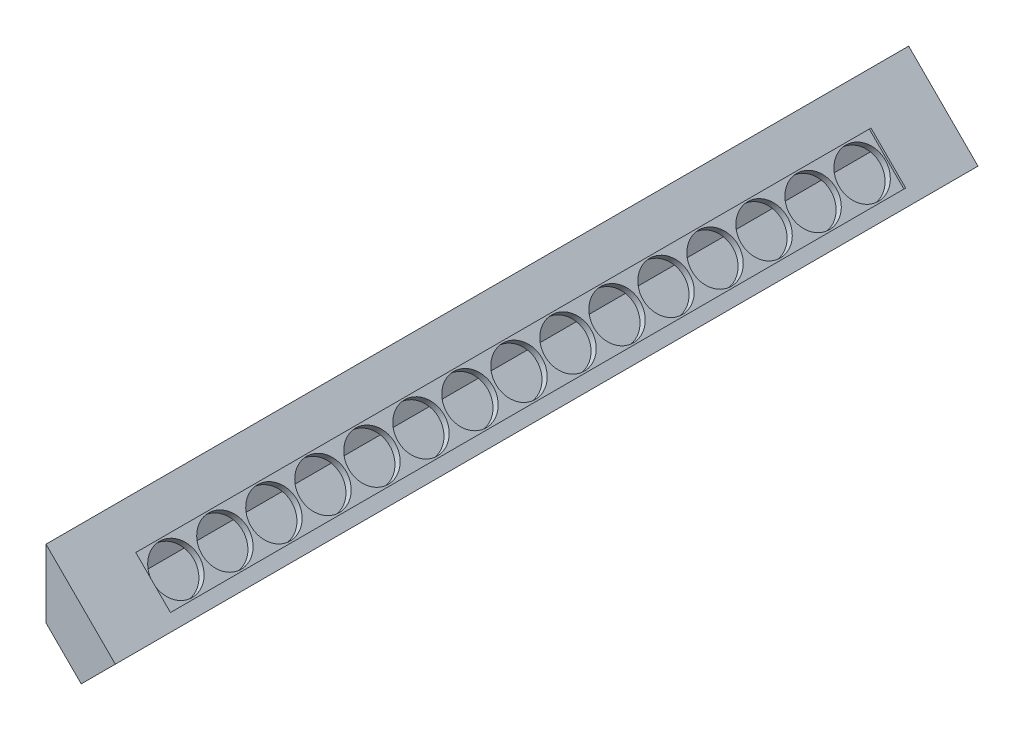
ISO-10303-21;
HEADER;
FILE_DESCRIPTION(('STEP AP214'),'2;1');
FILE_NAME('part.step','',(''),(''),'','','');
FILE_SCHEMA(('AUTOMOTIVE_DESIGN { 1 0 10303 214 1 1 1 1 }'));
ENDSEC;
DATA;
#1=APPLICATION_CONTEXT('core data for automotive mechanical design processes');
#2=APPLICATION_PROTOCOL_DEFINITION('international standard','automotive_design',2000,#1);
#3=PRODUCT_CONTEXT('',#1,'mechanical');
#4=PRODUCT('Part','Part','',(#3));
#5=PRODUCT_RELATED_PRODUCT_CATEGORY('part','',(#4));
#6=PRODUCT_DEFINITION_FORMATION('','',#4);
#7=PRODUCT_DEFINITION_CONTEXT('part definition',#1,'design');
#8=PRODUCT_DEFINITION('design','',#6,#7);
#9=PRODUCT_DEFINITION_SHAPE('','',#8);
#10=(LENGTH_UNIT() NAMED_UNIT(*) SI_UNIT(.MILLI.,.METRE.));
#11=(NAMED_UNIT(*) PLANE_ANGLE_UNIT() SI_UNIT($,.RADIAN.));
#12=(NAMED_UNIT(*) SI_UNIT($,.STERADIAN.) SOLID_ANGLE_UNIT());
#13=UNCERTAINTY_MEASURE_WITH_UNIT(LENGTH_MEASURE(1.E-05),#10,'distance_accuracy_value','');
#14=(GEOMETRIC_REPRESENTATION_CONTEXT(3) GLOBAL_UNCERTAINTY_ASSIGNED_CONTEXT((#13)) GLOBAL_UNIT_ASSIGNED_CONTEXT((#10,
#11,#12)) REPRESENTATION_CONTEXT('',''));
#15=CARTESIAN_POINT('',(0.,0.,0.));
#16=DIRECTION('',(0.,0.,1.));
#17=DIRECTION('',(1.,0.,0.));
#18=AXIS2_PLACEMENT_3D('',#15,#16,#17);
#19=CARTESIAN_POINT('',(-36.6281312654624,16.2634559672912,440.));
#20=DIRECTION('',(0.707106781186565,0.70710678118653,0.));
#21=DIRECTION('',(-0.70710678118653,0.707106781186565,0.));
#22=AXIS2_PLACEMENT_3D('',#19,#20,#21);
#23=CYLINDRICAL_SURFACE('',#22,23.5000000000004);
#24=CARTESIAN_POINT('',(-28.2135605693423,24.6780266634109,440.));
#25=DIRECTION('',(0.707106781186565,0.70710678118653,0.));
#26=DIRECTION('',(-0.70710678118653,0.707106781186565,0.));
#27=AXIS2_PLACEMENT_3D('',#24,#25,#26);
#28=CIRCLE('',#27,23.5000000000004);
#29=CARTESIAN_POINT('',(-44.830569927226,41.2950360212954,440.));
#30=VERTEX_POINT('',#29);
#31=EDGE_CURVE('E281',#30,#30,#28,.T.);
#32=ORIENTED_EDGE('',*,*,#31,.T.);
#33=EDGE_LOOP('',(#32));
#34=FACE_BOUND('',#33,.T.);
#35=CARTESIAN_POINT('',(-33.5168614282421,19.3747258045113,440.));
#36=DIRECTION('',(-0.707106781186549,-0.707106781186546,0.));
#37=DIRECTION('',(0.707106781186546,-0.707106781186549,0.));
#38=AXIS2_PLACEMENT_3D('',#35,#36,#37);
#39=CIRCLE('',#38,23.5000000000004);
#40=CARTESIAN_POINT('',(-16.899852070358,2.75771644662712,440.));
#41=VERTEX_POINT('',#40);
#42=EDGE_CURVE('E155',#41,#41,#39,.F.);
#43=ORIENTED_EDGE('',*,*,#42,.F.);
#44=EDGE_LOOP('',(#43));
#45=FACE_BOUND('',#44,.T.);
#46=ADVANCED_FACE('F33',(#34,#45),#23,.F.);
#47=CARTESIAN_POINT('',(-36.6281312654612,16.2634559672899,690.));
#48=DIRECTION('',(0.707106781186565,0.70710678118653,0.));
#49=DIRECTION('',(-0.70710678118653,0.707106781186565,0.));
#50=AXIS2_PLACEMENT_3D('',#47,#48,#49);
#51=CYLINDRICAL_SURFACE('',#50,23.5000000000003);
#52=CARTESIAN_POINT('',(-28.2135605693411,24.6780266634096,690.));
#53=DIRECTION('',(0.707106781186565,0.70710678118653,0.));
#54=DIRECTION('',(-0.70710678118653,0.707106781186565,0.));
#55=AXIS2_PLACEMENT_3D('',#52,#53,#54);
#56=CIRCLE('',#55,23.5000000000003);
#57=CARTESIAN_POINT('',(-44.8305699272247,41.2950360212941,690.));
#58=VERTEX_POINT('',#57);
#59=EDGE_CURVE('E272',#58,#58,#56,.T.);
#60=ORIENTED_EDGE('',*,*,#59,.T.);
#61=EDGE_LOOP('',(#60));
#62=FACE_BOUND('',#61,.T.);
#63=CARTESIAN_POINT('',(-33.5168614282409,19.3747258045101,690.));
#64=DIRECTION('',(-0.707106781186549,-0.707106781186546,0.));
#65=DIRECTION('',(0.707106781186546,-0.707106781186549,0.));
#66=AXIS2_PLACEMENT_3D('',#63,#64,#65);
#67=CIRCLE('',#66,23.5000000000003);
#68=CARTESIAN_POINT('',(-16.8998520703569,2.75771644662597,690.));
#69=VERTEX_POINT('',#68);
#70=EDGE_CURVE('E244',#69,#69,#67,.F.);
#71=ORIENTED_EDGE('',*,*,#70,.F.);
#72=EDGE_LOOP('',(#71));
#73=FACE_BOUND('',#72,.T.);
#74=ADVANCED_FACE('F393',(#62,#73),#51,.F.);
#75=CARTESIAN_POINT('',(-36.6281312654609,16.2634559672897,740.));
#76=DIRECTION('',(0.707106781186565,0.70710678118653,0.));
#77=DIRECTION('',(-0.70710678118653,0.707106781186565,0.));
#78=AXIS2_PLACEMENT_3D('',#75,#76,#77);
#79=CYLINDRICAL_SURFACE('',#78,23.5000000000002);
#80=CARTESIAN_POINT('',(-28.2135605693408,24.6780266634094,740.));
#81=DIRECTION('',(0.707106781186565,0.70710678118653,0.));
#82=DIRECTION('',(-0.70710678118653,0.707106781186565,0.));
#83=AXIS2_PLACEMENT_3D('',#80,#81,#82);
#84=CIRCLE('',#83,23.5000000000002);
#85=CARTESIAN_POINT('',(-44.8305699272244,41.2950360212938,740.));
#86=VERTEX_POINT('',#85);
#87=EDGE_CURVE('E267',#86,#86,#84,.T.);
#88=ORIENTED_EDGE('',*,*,#87,.T.);
#89=EDGE_LOOP('',(#88));
#90=FACE_BOUND('',#89,.T.);
#91=CARTESIAN_POINT('',(-33.5168614282406,19.3747258045098,740.));
#92=DIRECTION('',(-0.707106781186549,-0.707106781186546,0.));
#93=DIRECTION('',(0.707106781186546,-0.707106781186549,0.));
#94=AXIS2_PLACEMENT_3D('',#91,#92,#93);
#95=CIRCLE('',#94,23.5000000000002);
#96=CARTESIAN_POINT('',(-16.8998520703567,2.75771644662581,740.));
#97=VERTEX_POINT('',#96);
#98=EDGE_CURVE('E250',#97,#97,#95,.F.);
#99=ORIENTED_EDGE('',*,*,#98,.F.);
#100=EDGE_LOOP('',(#99));
#101=FACE_BOUND('',#100,.T.);
#102=ADVANCED_FACE('F399',(#90,#101),#79,.F.);
#103=CARTESIAN_POINT('',(-36.6281312654607,16.2634559672895,790.));
#104=DIRECTION('',(0.707106781186565,0.70710678118653,0.));
#105=DIRECTION('',(-0.70710678118653,0.707106781186565,0.));
#106=AXIS2_PLACEMENT_3D('',#103,#104,#105);
#107=CYLINDRICAL_SURFACE('',#106,23.5000000000003);
#108=CARTESIAN_POINT('',(-28.2135605693406,24.6780266634092,790.));
#109=DIRECTION('',(0.707106781186565,0.70710678118653,0.));
#110=DIRECTION('',(-0.70710678118653,0.707106781186565,0.));
#111=AXIS2_PLACEMENT_3D('',#108,#109,#110);
#112=CIRCLE('',#111,23.5000000000003);
#113=CARTESIAN_POINT('',(-44.8305699272242,41.2950360212936,790.));
#114=VERTEX_POINT('',#113);
#115=EDGE_CURVE('E264',#114,#114,#112,.T.);
#116=ORIENTED_EDGE('',*,*,#115,.T.);
#117=EDGE_LOOP('',(#116));
#118=FACE_BOUND('',#117,.T.);
#119=CARTESIAN_POINT('',(-33.5168614282404,19.3747258045096,790.));
#120=DIRECTION('',(-0.707106781186549,-0.707106781186546,0.));
#121=DIRECTION('',(0.707106781186546,-0.707106781186549,0.));
#122=AXIS2_PLACEMENT_3D('',#119,#120,#121);
#123=CIRCLE('',#122,23.5000000000003);
#124=CARTESIAN_POINT('',(-16.8998520703564,2.75771644662549,790.));
#125=VERTEX_POINT('',#124);
#126=EDGE_CURVE('E247',#125,#125,#123,.F.);
#127=ORIENTED_EDGE('',*,*,#126,.F.);
#128=EDGE_LOOP('',(#127));
#129=FACE_BOUND('',#128,.T.);
#130=ADVANCED_FACE('F578',(#118,#129),#107,.F.);
#131=CARTESIAN_POINT('',(-36.6281312654624,16.2634559672912,390.));
#132=DIRECTION('',(0.707106781186565,0.70710678118653,0.));
#133=DIRECTION('',(-0.70710678118653,0.707106781186565,0.));
#134=AXIS2_PLACEMENT_3D('',#131,#132,#133);
#135=CYLINDRICAL_SURFACE('',#134,23.5000000000004);
#136=CARTESIAN_POINT('',(-28.2135605693423,24.6780266634109,390.));
#137=DIRECTION('',(0.707106781186565,0.70710678118653,0.));
#138=DIRECTION('',(-0.70710678118653,0.707106781186565,0.));
#139=AXIS2_PLACEMENT_3D('',#136,#137,#138);
#140=CIRCLE('',#139,23.5000000000004);
#141=CARTESIAN_POINT('',(-44.830569927226,41.2950360212954,390.));
#142=VERTEX_POINT('',#141);
#143=EDGE_CURVE('E268',#142,#142,#140,.T.);
#144=ORIENTED_EDGE('',*,*,#143,.T.);
#145=EDGE_LOOP('',(#144));
#146=FACE_BOUND('',#145,.T.);
#147=CARTESIAN_POINT('',(-33.5168614282421,19.3747258045113,390.));
#148=DIRECTION('',(-0.707106781186549,-0.707106781186546,0.));
#149=DIRECTION('',(0.707106781186546,-0.707106781186549,0.));
#150=AXIS2_PLACEMENT_3D('',#147,#148,#149);
#151=CIRCLE('',#150,23.5000000000004);
#152=CARTESIAN_POINT('',(-16.899852070358,2.75771644662712,390.));
#153=VERTEX_POINT('',#152);
#154=EDGE_CURVE('E231',#153,#153,#151,.F.);
#155=ORIENTED_EDGE('',*,*,#154,.F.);
#156=EDGE_LOOP('',(#155));
#157=FACE_BOUND('',#156,.T.);
#158=ADVANCED_FACE('F587',(#146,#157),#135,.F.);
#159=CARTESIAN_POINT('',(-36.6281312654614,16.2634559672902,640.));
#160=DIRECTION('',(0.707106781186565,0.70710678118653,0.));
#161=DIRECTION('',(-0.70710678118653,0.707106781186565,0.));
#162=AXIS2_PLACEMENT_3D('',#159,#160,#161);
#163=CYLINDRICAL_SURFACE('',#162,23.5000000000002);
#164=CARTESIAN_POINT('',(-28.2135605693413,24.6780266634099,640.));
#165=DIRECTION('',(0.707106781186565,0.70710678118653,0.));
#166=DIRECTION('',(-0.70710678118653,0.707106781186565,0.));
#167=AXIS2_PLACEMENT_3D('',#164,#165,#166);
#168=CIRCLE('',#167,23.5000000000002);
#169=CARTESIAN_POINT('',(-44.8305699272249,41.2950360212943,640.));
#170=VERTEX_POINT('',#169);
#171=EDGE_CURVE('E275',#170,#170,#168,.T.);
#172=ORIENTED_EDGE('',*,*,#171,.T.);
#173=EDGE_LOOP('',(#172));
#174=FACE_BOUND('',#173,.T.);
#175=CARTESIAN_POINT('',(-33.5168614282411,19.3747258045103,640.));
#176=DIRECTION('',(-0.707106781186549,-0.707106781186546,0.));
#177=DIRECTION('',(0.707106781186546,-0.707106781186549,0.));
#178=AXIS2_PLACEMENT_3D('',#175,#176,#177);
#179=CIRCLE('',#178,23.5000000000002);
#180=CARTESIAN_POINT('',(-16.8998520703572,2.75771644662631,640.));
#181=VERTEX_POINT('',#180);
#182=EDGE_CURVE('E241',#181,#181,#179,.F.);
#183=ORIENTED_EDGE('',*,*,#182,.F.);
#184=EDGE_LOOP('',(#183));
#185=FACE_BOUND('',#184,.T.);
#186=ADVANCED_FACE('F596',(#174,#185),#163,.F.);
#187=CARTESIAN_POINT('',(-36.6281312654617,16.2634559672904,590.));
#188=DIRECTION('',(0.707106781186565,0.70710678118653,0.));
#189=DIRECTION('',(-0.70710678118653,0.707106781186565,0.));
#190=AXIS2_PLACEMENT_3D('',#187,#188,#189);
#191=CYLINDRICAL_SURFACE('',#190,23.5000000000003);
#192=CARTESIAN_POINT('',(-28.2135605693416,24.6780266634101,590.));
#193=DIRECTION('',(0.707106781186565,0.70710678118653,0.));
#194=DIRECTION('',(-0.70710678118653,0.707106781186565,0.));
#195=AXIS2_PLACEMENT_3D('',#192,#193,#194);
#196=CIRCLE('',#195,23.5000000000003);
#197=CARTESIAN_POINT('',(-44.8305699272252,41.2950360212946,590.));
#198=VERTEX_POINT('',#197);
#199=EDGE_CURVE('E285',#198,#198,#196,.T.);
#200=ORIENTED_EDGE('',*,*,#199,.T.);
#201=EDGE_LOOP('',(#200));
#202=FACE_BOUND('',#201,.T.);
#203=CARTESIAN_POINT('',(-33.5168614282414,19.3747258045106,590.));
#204=DIRECTION('',(-0.707106781186549,-0.707106781186546,0.));
#205=DIRECTION('',(0.707106781186546,-0.707106781186549,0.));
#206=AXIS2_PLACEMENT_3D('',#203,#204,#205);
#207=CIRCLE('',#206,23.5000000000003);
#208=CARTESIAN_POINT('',(-16.8998520703574,2.75771644662648,590.));
#209=VERTEX_POINT('',#208);
#210=EDGE_CURVE('E238',#209,#209,#207,.F.);
#211=ORIENTED_EDGE('',*,*,#210,.F.);
#212=EDGE_LOOP('',(#211));
#213=FACE_BOUND('',#212,.T.);
#214=ADVANCED_FACE('F605',(#202,#213),#191,.F.);
#215=CARTESIAN_POINT('',(-36.6281312654619,16.2634559672907,540.));
#216=DIRECTION('',(0.707106781186565,0.70710678118653,0.));
#217=DIRECTION('',(-0.70710678118653,0.707106781186565,0.));
#218=AXIS2_PLACEMENT_3D('',#215,#216,#217);
#219=CYLINDRICAL_SURFACE('',#218,23.5000000000003);
#220=CARTESIAN_POINT('',(-28.2135605693418,24.6780266634104,540.));
#221=DIRECTION('',(0.707106781186565,0.70710678118653,0.));
#222=DIRECTION('',(-0.70710678118653,0.707106781186565,0.));
#223=AXIS2_PLACEMENT_3D('',#220,#221,#222);
#224=CIRCLE('',#223,23.5000000000003);
#225=CARTESIAN_POINT('',(-44.8305699272254,41.2950360212949,540.));
#226=VERTEX_POINT('',#225);
#227=EDGE_CURVE('E282',#226,#226,#224,.T.);
#228=ORIENTED_EDGE('',*,*,#227,.T.);
#229=EDGE_LOOP('',(#228));
#230=FACE_BOUND('',#229,.T.);
#231=CARTESIAN_POINT('',(-33.5168614282416,19.3747258045108,540.));
#232=DIRECTION('',(-0.707106781186549,-0.707106781186546,0.));
#233=DIRECTION('',(0.707106781186546,-0.707106781186549,0.));
#234=AXIS2_PLACEMENT_3D('',#231,#232,#233);
#235=CIRCLE('',#234,23.5000000000003);
#236=CARTESIAN_POINT('',(-16.8998520703576,2.75771644662672,540.));
#237=VERTEX_POINT('',#236);
#238=EDGE_CURVE('E235',#237,#237,#235,.F.);
#239=ORIENTED_EDGE('',*,*,#238,.F.);
#240=EDGE_LOOP('',(#239));
#241=FACE_BOUND('',#240,.T.);
#242=ADVANCED_FACE('F614',(#230,#241),#219,.F.);
#243=CARTESIAN_POINT('',(-36.6281312654622,16.2634559672909,490.));
#244=DIRECTION('',(0.707106781186565,0.70710678118653,0.));
#245=DIRECTION('',(-0.70710678118653,0.707106781186565,0.));
#246=AXIS2_PLACEMENT_3D('',#243,#244,#245);
#247=CYLINDRICAL_SURFACE('',#246,23.5000000000004);
#248=CARTESIAN_POINT('',(-28.2135605693421,24.6780266634106,490.));
#249=DIRECTION('',(0.707106781186565,0.70710678118653,0.));
#250=DIRECTION('',(-0.70710678118653,0.707106781186565,0.));
#251=AXIS2_PLACEMENT_3D('',#248,#249,#250);
#252=CIRCLE('',#251,23.5000000000004);
#253=CARTESIAN_POINT('',(-44.8305699272258,41.2950360212952,490.));
#254=VERTEX_POINT('',#253);
#255=EDGE_CURVE('E278',#254,#254,#252,.T.);
#256=ORIENTED_EDGE('',*,*,#255,.T.);
#257=EDGE_LOOP('',(#256));
#258=FACE_BOUND('',#257,.T.);
#259=CARTESIAN_POINT('',(-33.5168614282419,19.3747258045111,490.));
#260=DIRECTION('',(-0.707106781186549,-0.707106781186546,0.));
#261=DIRECTION('',(0.707106781186546,-0.707106781186549,0.));
#262=AXIS2_PLACEMENT_3D('',#259,#260,#261);
#263=CIRCLE('',#262,23.5000000000004);
#264=CARTESIAN_POINT('',(-16.8998520703577,2.75771644662684,490.));
#265=VERTEX_POINT('',#264);
#266=EDGE_CURVE('E232',#265,#265,#263,.F.);
#267=ORIENTED_EDGE('',*,*,#266,.F.);
#268=EDGE_LOOP('',(#267));
#269=FACE_BOUND('',#268,.T.);
#270=ADVANCED_FACE('F623',(#258,#269),#247,.F.);
#271=CARTESIAN_POINT('',(-36.6281312654624,16.2634559672912,340.));
#272=DIRECTION('',(0.707106781186565,0.70710678118653,0.));
#273=DIRECTION('',(-0.70710678118653,0.707106781186565,0.));
#274=AXIS2_PLACEMENT_3D('',#271,#272,#273);
#275=CYLINDRICAL_SURFACE('',#274,23.5000000000004);
#276=CARTESIAN_POINT('',(-28.2135605693423,24.6780266634109,340.));
#277=DIRECTION('',(0.707106781186565,0.70710678118653,0.));
#278=DIRECTION('',(-0.70710678118653,0.707106781186565,0.));
#279=AXIS2_PLACEMENT_3D('',#276,#277,#278);
#280=CIRCLE('',#279,23.5000000000004);
#281=CARTESIAN_POINT('',(-44.830569927226,41.2950360212954,340.));
#282=VERTEX_POINT('',#281);
#283=EDGE_CURVE('E271',#282,#282,#280,.T.);
#284=ORIENTED_EDGE('',*,*,#283,.T.);
#285=EDGE_LOOP('',(#284));
#286=FACE_BOUND('',#285,.T.);
#287=CARTESIAN_POINT('',(-33.5168614282421,19.3747258045113,340.));
#288=DIRECTION('',(-0.707106781186549,-0.707106781186546,0.));
#289=DIRECTION('',(0.707106781186546,-0.707106781186549,0.));
#290=AXIS2_PLACEMENT_3D('',#287,#288,#289);
#291=CIRCLE('',#290,23.5000000000004);
#292=CARTESIAN_POINT('',(-16.899852070358,2.75771644662712,340.));
#293=VERTEX_POINT('',#292);
#294=EDGE_CURVE('E228',#293,#293,#291,.F.);
#295=ORIENTED_EDGE('',*,*,#294,.F.);
#296=EDGE_LOOP('',(#295));
#297=FACE_BOUND('',#296,.T.);
#298=ADVANCED_FACE('F632',(#286,#297),#275,.F.);
#299=CARTESIAN_POINT('',(-36.6281312654624,16.2634559672912,290.));
#300=DIRECTION('',(0.707106781186565,0.70710678118653,0.));
#301=DIRECTION('',(-0.70710678118653,0.707106781186565,0.));
#302=AXIS2_PLACEMENT_3D('',#299,#300,#301);
#303=CYLINDRICAL_SURFACE('',#302,23.5000000000004);
#304=CARTESIAN_POINT('',(-28.2135605693423,24.6780266634109,290.));
#305=DIRECTION('',(0.707106781186565,0.70710678118653,0.));
#306=DIRECTION('',(-0.70710678118653,0.707106781186565,0.));
#307=AXIS2_PLACEMENT_3D('',#304,#305,#306);
#308=CIRCLE('',#307,23.5000000000004);
#309=CARTESIAN_POINT('',(-44.830569927226,41.2950360212954,290.));
#310=VERTEX_POINT('',#309);
#311=EDGE_CURVE('E292',#310,#310,#308,.T.);
#312=ORIENTED_EDGE('',*,*,#311,.T.);
#313=EDGE_LOOP('',(#312));
#314=FACE_BOUND('',#313,.T.);
#315=CARTESIAN_POINT('',(-33.5168614282421,19.3747258045113,290.));
#316=DIRECTION('',(-0.707106781186549,-0.707106781186546,0.));
#317=DIRECTION('',(0.707106781186546,-0.707106781186549,0.));
#318=AXIS2_PLACEMENT_3D('',#315,#316,#317);
#319=CIRCLE('',#318,23.5000000000004);
#320=CARTESIAN_POINT('',(-16.899852070358,2.75771644662712,290.));
#321=VERTEX_POINT('',#320);
#322=EDGE_CURVE('E225',#321,#321,#319,.F.);
#323=ORIENTED_EDGE('',*,*,#322,.F.);
#324=EDGE_LOOP('',(#323));
#325=FACE_BOUND('',#324,.T.);
#326=ADVANCED_FACE('F641',(#314,#325),#303,.F.);
#327=CARTESIAN_POINT('',(-36.6281312654624,16.2634559672912,240.));
#328=DIRECTION('',(0.707106781186565,0.70710678118653,0.));
#329=DIRECTION('',(-0.70710678118653,0.707106781186565,0.));
#330=AXIS2_PLACEMENT_3D('',#327,#328,#329);
#331=CYLINDRICAL_SURFACE('',#330,23.5000000000004);
#332=CARTESIAN_POINT('',(-28.2135605693423,24.6780266634109,240.));
#333=DIRECTION('',(0.707106781186565,0.70710678118653,0.));
#334=DIRECTION('',(-0.70710678118653,0.707106781186565,0.));
#335=AXIS2_PLACEMENT_3D('',#332,#333,#334);
#336=CIRCLE('',#335,23.5000000000004);
#337=CARTESIAN_POINT('',(-44.8305699272261,41.2950360212955,240.));
#338=VERTEX_POINT('',#337);
#339=EDGE_CURVE('E295',#338,#338,#336,.T.);
#340=ORIENTED_EDGE('',*,*,#339,.T.);
#341=EDGE_LOOP('',(#340));
#342=FACE_BOUND('',#341,.T.);
#343=CARTESIAN_POINT('',(-33.5168614282421,19.3747258045113,240.));
#344=DIRECTION('',(-0.707106781186549,-0.707106781186546,0.));
#345=DIRECTION('',(0.707106781186546,-0.707106781186549,0.));
#346=AXIS2_PLACEMENT_3D('',#343,#344,#345);
#347=CIRCLE('',#346,23.5000000000004);
#348=CARTESIAN_POINT('',(-16.899852070358,2.75771644662709,240.));
#349=VERTEX_POINT('',#348);
#350=EDGE_CURVE('E222',#349,#349,#347,.F.);
#351=ORIENTED_EDGE('',*,*,#350,.F.);
#352=EDGE_LOOP('',(#351));
#353=FACE_BOUND('',#352,.T.);
#354=ADVANCED_FACE('F650',(#342,#353),#331,.F.);
#355=CARTESIAN_POINT('',(-36.6281312654624,16.2634559672912,190.));
#356=DIRECTION('',(0.707106781186565,0.70710678118653,0.));
#357=DIRECTION('',(-0.70710678118653,0.707106781186565,0.));
#358=AXIS2_PLACEMENT_3D('',#355,#356,#357);
#359=CYLINDRICAL_SURFACE('',#358,23.5000000000004);
#360=CARTESIAN_POINT('',(-28.2135605693423,24.6780266634109,190.));
#361=DIRECTION('',(0.707106781186565,0.70710678118653,0.));
#362=DIRECTION('',(-0.70710678118653,0.707106781186565,0.));
#363=AXIS2_PLACEMENT_3D('',#360,#361,#362);
#364=CIRCLE('',#363,23.5000000000004);
#365=CARTESIAN_POINT('',(-44.8305699272261,41.2950360212955,190.));
#366=VERTEX_POINT('',#365);
#367=EDGE_CURVE('E298',#366,#366,#364,.T.);
#368=ORIENTED_EDGE('',*,*,#367,.T.);
#369=EDGE_LOOP('',(#368));
#370=FACE_BOUND('',#369,.T.);
#371=CARTESIAN_POINT('',(-33.5168614282421,19.3747258045113,190.));
#372=DIRECTION('',(-0.707106781186549,-0.707106781186546,0.));
#373=DIRECTION('',(0.707106781186546,-0.707106781186549,0.));
#374=AXIS2_PLACEMENT_3D('',#371,#372,#373);
#375=CIRCLE('',#374,23.5000000000004);
#376=CARTESIAN_POINT('',(-16.899852070358,2.75771644662709,190.));
#377=VERTEX_POINT('',#376);
#378=EDGE_CURVE('E219',#377,#377,#375,.F.);
#379=ORIENTED_EDGE('',*,*,#378,.F.);
#380=EDGE_LOOP('',(#379));
#381=FACE_BOUND('',#380,.T.);
#382=ADVANCED_FACE('F659',(#370,#381),#359,.F.);
#383=CARTESIAN_POINT('',(-36.6281312654624,16.2634559672912,140.));
#384=DIRECTION('',(0.707106781186565,0.70710678118653,0.));
#385=DIRECTION('',(-0.70710678118653,0.707106781186565,0.));
#386=AXIS2_PLACEMENT_3D('',#383,#384,#385);
#387=CYLINDRICAL_SURFACE('',#386,23.5000000000004);
#388=CARTESIAN_POINT('',(-28.2135605693423,24.6780266634109,140.));
#389=DIRECTION('',(0.707106781186565,0.70710678118653,0.));
#390=DIRECTION('',(-0.70710678118653,0.707106781186565,0.));
#391=AXIS2_PLACEMENT_3D('',#388,#389,#390);
#392=CIRCLE('',#391,23.5000000000004);
#393=CARTESIAN_POINT('',(-44.8305699272261,41.2950360212955,140.));
#394=VERTEX_POINT('',#393);
#395=EDGE_CURVE('E301',#394,#394,#392,.T.);
#396=ORIENTED_EDGE('',*,*,#395,.T.);
#397=EDGE_LOOP('',(#396));
#398=FACE_BOUND('',#397,.T.);
#399=CARTESIAN_POINT('',(-33.5168614282421,19.3747258045113,140.));
#400=DIRECTION('',(-0.707106781186549,-0.707106781186546,0.));
#401=DIRECTION('',(0.707106781186546,-0.707106781186549,0.));
#402=AXIS2_PLACEMENT_3D('',#399,#400,#401);
#403=CIRCLE('',#402,23.5000000000004);
#404=CARTESIAN_POINT('',(-16.899852070358,2.75771644662709,140.));
#405=VERTEX_POINT('',#404);
#406=EDGE_CURVE('E216',#405,#405,#403,.F.);
#407=ORIENTED_EDGE('',*,*,#406,.F.);
#408=EDGE_LOOP('',(#407));
#409=FACE_BOUND('',#408,.T.);
#410=ADVANCED_FACE('F388',(#398,#409),#387,.F.);
#411=CARTESIAN_POINT('',(-36.6281312654624,16.2634559672912,90.));
#412=DIRECTION('',(0.707106781186565,0.70710678118653,0.));
#413=DIRECTION('',(-0.70710678118653,0.707106781186565,0.));
#414=AXIS2_PLACEMENT_3D('',#411,#412,#413);
#415=CYLINDRICAL_SURFACE('',#414,23.5000000000004);
#416=CARTESIAN_POINT('',(-28.2135605693423,24.6780266634109,90.));
#417=DIRECTION('',(0.707106781186565,0.70710678118653,0.));
#418=DIRECTION('',(-0.70710678118653,0.707106781186565,0.));
#419=AXIS2_PLACEMENT_3D('',#416,#417,#418);
#420=CIRCLE('',#419,23.5000000000004);
#421=CARTESIAN_POINT('',(-44.8305699272261,41.2950360212955,90.));
#422=VERTEX_POINT('',#421);
#423=EDGE_CURVE('E263',#422,#422,#420,.T.);
#424=ORIENTED_EDGE('',*,*,#423,.T.);
#425=EDGE_LOOP('',(#424));
#426=FACE_BOUND('',#425,.T.);
#427=CARTESIAN_POINT('',(-33.5168614282421,19.3747258045113,90.));
#428=DIRECTION('',(-0.707106781186549,-0.707106781186546,0.));
#429=DIRECTION('',(0.707106781186546,-0.707106781186549,0.));
#430=AXIS2_PLACEMENT_3D('',#427,#428,#429);
#431=CIRCLE('',#430,23.5000000000004);
#432=CARTESIAN_POINT('',(-16.899852070358,2.75771644662709,90.));
#433=VERTEX_POINT('',#432);
#434=EDGE_CURVE('E213',#433,#433,#431,.F.);
#435=ORIENTED_EDGE('',*,*,#434,.F.);
#436=EDGE_LOOP('',(#435));
#437=FACE_BOUND('',#436,.T.);
#438=ADVANCED_FACE('F381',(#426,#437),#415,.F.);
#439=CARTESIAN_POINT('',(0.,0.,880.));
#440=DIRECTION('',(-0.707106781186547,-0.707106781186547,0.));
#441=DIRECTION('',(0.707106781186548,-0.707106781186548,0.));
#442=AXIS2_PLACEMENT_3D('',#439,#440,#441);
#443=PLANE('',#442);
#444=DIRECTION('',(0.,0.,1.));
#445=VECTOR('',#444,1.);
#446=CARTESIAN_POINT('',(-44.1234631460402,44.1234631460404,815.));
#447=LINE('',#446,#445);
#448=CARTESIAN_POINT('',(-44.1234631460407,44.1234631460407,65.0000000000001));
#449=VERTEX_POINT('',#448);
#450=CARTESIAN_POINT('',(-44.1234631460402,44.1234631460404,815.));
#451=VERTEX_POINT('',#450);
#452=EDGE_CURVE('E323',#449,#451,#447,.T.);
#453=ORIENTED_EDGE('',*,*,#452,.F.);
#454=DIRECTION('',(-0.707106781186546,0.707106781186549,0.));
#455=VECTOR('',#454,1.);
#456=CARTESIAN_POINT('',(-8.7681240867131,8.76812408671314,64.9999999999999));
#457=LINE('',#456,#455);
#458=CARTESIAN_POINT('',(-8.7681240867131,8.76812408671314,64.9999999999999));
#459=VERTEX_POINT('',#458);
#460=EDGE_CURVE('E48',#459,#449,#457,.T.);
#461=ORIENTED_EDGE('',*,*,#460,.F.);
#462=DIRECTION('',(0.,0.,-1.));
#463=VECTOR('',#462,1.);
#464=CARTESIAN_POINT('',(-8.76812408671275,8.76812408671279,815.));
#465=LINE('',#464,#463);
#466=CARTESIAN_POINT('',(-8.76812408671275,8.76812408671279,815.));
#467=VERTEX_POINT('',#466);
#468=EDGE_CURVE('E312',#467,#459,#465,.T.);
#469=ORIENTED_EDGE('',*,*,#468,.F.);
#470=DIRECTION('',(0.707106781186546,-0.707106781186549,0.));
#471=VECTOR('',#470,1.);
#472=CARTESIAN_POINT('',(-8.76812408671275,8.76812408671279,815.));
#473=LINE('',#472,#471);
#474=EDGE_CURVE('E326',#451,#467,#473,.T.);
#475=ORIENTED_EDGE('',*,*,#474,.F.);
#476=EDGE_LOOP('',(#453,#461,#469,#475));
#477=FACE_BOUND('',#476,.T.);
#478=DIRECTION('',(-0.707106781186547,0.707106781186547,0.));
#479=VECTOR('',#478,1.);
#480=CARTESIAN_POINT('',(0.,0.,0.));
#481=LINE('',#480,#479);
#482=CARTESIAN_POINT('',(0.,0.,0.));
#483=VERTEX_POINT('',#482);
#484=CARTESIAN_POINT('',(-70.7106781186548,70.7106781186548,0.));
#485=VERTEX_POINT('',#484);
#486=EDGE_CURVE('E333',#483,#485,#481,.T.);
#487=ORIENTED_EDGE('',*,*,#486,.T.);
#488=DIRECTION('',(0.,0.,-1.));
#489=VECTOR('',#488,1.);
#490=CARTESIAN_POINT('',(-70.7106781186548,70.7106781186548,880.));
#491=LINE('',#490,#489);
#492=CARTESIAN_POINT('',(-70.7106781186548,70.7106781186548,880.));
#493=VERTEX_POINT('',#492);
#494=EDGE_CURVE('E355',#493,#485,#491,.T.);
#495=ORIENTED_EDGE('',*,*,#494,.F.);
#496=DIRECTION('',(-0.707106781186547,0.707106781186547,0.));
#497=VECTOR('',#496,1.);
#498=CARTESIAN_POINT('',(0.,0.,880.));
#499=LINE('',#498,#497);
#500=CARTESIAN_POINT('',(0.,0.,880.));
#501=VERTEX_POINT('',#500);
#502=EDGE_CURVE('E339',#501,#493,#499,.T.);
#503=ORIENTED_EDGE('',*,*,#502,.F.);
#504=DIRECTION('',(0.,0.,-1.));
#505=VECTOR('',#504,1.);
#506=CARTESIAN_POINT('',(0.,0.,880.));
#507=LINE('',#506,#505);
#508=EDGE_CURVE('E347',#501,#483,#507,.T.);
#509=ORIENTED_EDGE('',*,*,#508,.T.);
#510=EDGE_LOOP('',(#487,#495,#503,#509));
#511=FACE_BOUND('',#510,.T.);
#512=ADVANCED_FACE('F379',(#477,#511),#443,.F.);
#513=CARTESIAN_POINT('',(-70.7106781186548,70.7106781186548,880.));
#514=DIRECTION('',(1.,0.,0.));
#515=DIRECTION('',(0.,0.,-1.));
#516=AXIS2_PLACEMENT_3D('',#513,#514,#515);
#517=PLANE('',#516);
#518=DIRECTION('',(0.,-1.,0.));
#519=VECTOR('',#518,1.);
#520=CARTESIAN_POINT('',(-70.7106781186548,70.7106781186548,0.));
#521=LINE('',#520,#519);
#522=CARTESIAN_POINT('',(-70.7106781186548,1.13137084989842,0.));
#523=VERTEX_POINT('',#522);
#524=EDGE_CURVE('E350',#485,#523,#521,.T.);
#525=ORIENTED_EDGE('',*,*,#524,.T.);
#526=DIRECTION('',(0.,0.,1.));
#527=VECTOR('',#526,1.);
#528=CARTESIAN_POINT('',(-70.7106781186548,1.13137084989842,880.));
#529=LINE('',#528,#527);
#530=CARTESIAN_POINT('',(-70.7106781186548,1.13137084989842,880.));
#531=VERTEX_POINT('',#530);
#532=EDGE_CURVE('E41',#523,#531,#529,.T.);
#533=ORIENTED_EDGE('',*,*,#532,.T.);
#534=DIRECTION('',(0.,-1.,0.));
#535=VECTOR('',#534,1.);
#536=CARTESIAN_POINT('',(-70.7106781186548,70.7106781186548,880.));
#537=LINE('',#536,#535);
#538=EDGE_CURVE('E342',#493,#531,#537,.T.);
#539=ORIENTED_EDGE('',*,*,#538,.F.);
#540=ORIENTED_EDGE('',*,*,#494,.T.);
#541=EDGE_LOOP('',(#525,#533,#539,#540));
#542=FACE_BOUND('',#541,.T.);
#543=ADVANCED_FACE('F368',(#542),#517,.F.);
#544=CARTESIAN_POINT('',(-70.7106781186548,-70.7106781186548,880.));
#545=DIRECTION('',(-0.707106781186547,0.707106781186547,0.));
#546=DIRECTION('',(-0.707106781186548,-0.707106781186548,0.));
#547=AXIS2_PLACEMENT_3D('',#544,#545,#546);
#548=PLANE('',#547);
#549=DIRECTION('',(0.707106781186547,0.707106781186547,0.));
#550=VECTOR('',#549,1.);
#551=CARTESIAN_POINT('',(-70.7106781186548,-70.7106781186548,880.));
#552=LINE('',#551,#550);
#553=CARTESIAN_POINT('',(-34.7896536343782,-34.7896536343782,880.));
#554=VERTEX_POINT('',#553);
#555=EDGE_CURVE('E345',#554,#501,#552,.T.);
#556=ORIENTED_EDGE('',*,*,#555,.F.);
#557=DIRECTION('',(0.,0.,-1.));
#558=VECTOR('',#557,1.);
#559=CARTESIAN_POINT('',(-34.7896536343782,-34.7896536343782,880.));
#560=LINE('',#559,#558);
#561=CARTESIAN_POINT('',(-34.7896536343782,-34.7896536343782,0.));
#562=VERTEX_POINT('',#561);
#563=EDGE_CURVE('E358',#554,#562,#560,.T.);
#564=ORIENTED_EDGE('',*,*,#563,.T.);
#565=DIRECTION('',(0.707106781186547,0.707106781186547,0.));
#566=VECTOR('',#565,1.);
#567=CARTESIAN_POINT('',(-70.7106781186548,-70.7106781186548,0.));
#568=LINE('',#567,#566);
#569=EDGE_CURVE('E343',#562,#483,#568,.T.);
#570=ORIENTED_EDGE('',*,*,#569,.T.);
#571=ORIENTED_EDGE('',*,*,#508,.F.);
#572=EDGE_LOOP('',(#556,#564,#570,#571));
#573=FACE_BOUND('',#572,.T.);
#574=ADVANCED_FACE('F376',(#573),#548,.F.);
#575=CARTESIAN_POINT('',(0.,0.,880.));
#576=DIRECTION('',(0.,0.,-1.));
#577=DIRECTION('',(-1.,0.,0.));
#578=AXIS2_PLACEMENT_3D('',#575,#576,#577);
#579=PLANE('',#578);
#580=ORIENTED_EDGE('',*,*,#538,.T.);
#581=DIRECTION('',(-0.707106781186548,0.707106781186548,0.));
#582=VECTOR('',#581,1.);
#583=CARTESIAN_POINT('',(-34.7896536343782,-34.7896536343782,880.));
#584=LINE('',#583,#582);
#585=EDGE_CURVE('E11',#531,#554,#584,.F.);
#586=ORIENTED_EDGE('',*,*,#585,.T.);
#587=ORIENTED_EDGE('',*,*,#555,.T.);
#588=ORIENTED_EDGE('',*,*,#502,.T.);
#589=EDGE_LOOP('',(#580,#586,#587,#588));
#590=FACE_BOUND('',#589,.T.);
#591=ADVANCED_FACE('F373',(#590),#579,.F.);
#592=CARTESIAN_POINT('',(0.,0.,0.));
#593=DIRECTION('',(0.,0.,-1.));
#594=DIRECTION('',(-1.,0.,0.));
#595=AXIS2_PLACEMENT_3D('',#592,#593,#594);
#596=PLANE('',#595);
#597=ORIENTED_EDGE('',*,*,#569,.F.);
#598=DIRECTION('',(0.707106781186548,-0.707106781186548,0.));
#599=VECTOR('',#598,1.);
#600=CARTESIAN_POINT('',(-34.7896536343782,-34.7896536343782,0.));
#601=LINE('',#600,#599);
#602=EDGE_CURVE('E361',#562,#523,#601,.F.);
#603=ORIENTED_EDGE('',*,*,#602,.T.);
#604=ORIENTED_EDGE('',*,*,#524,.F.);
#605=ORIENTED_EDGE('',*,*,#486,.F.);
#606=EDGE_LOOP('',(#597,#603,#604,#605));
#607=FACE_BOUND('',#606,.T.);
#608=ADVANCED_FACE('F364',(#607),#596,.T.);
#609=CARTESIAN_POINT('',(-34.7896536343782,-34.7896536343782,880.));
#610=DIRECTION('',(0.707106781186547,0.707106781186547,0.));
#611=DIRECTION('',(0.,0.,-1.));
#612=AXIS2_PLACEMENT_3D('',#609,#610,#611);
#613=PLANE('',#612);
#614=ORIENTED_EDGE('',*,*,#585,.F.);
#615=ORIENTED_EDGE('',*,*,#532,.F.);
#616=ORIENTED_EDGE('',*,*,#602,.F.);
#617=ORIENTED_EDGE('',*,*,#563,.F.);
#618=EDGE_LOOP('',(#614,#615,#616,#617));
#619=FACE_BOUND('',#618,.T.);
#620=ADVANCED_FACE('F35',(#619),#613,.F.);
#621=CARTESIAN_POINT('',(-10.5358910396795,7.00035713374678,64.9999999999999));
#622=DIRECTION('',(0.,0.,-1.));
#623=DIRECTION('',(0.,1.,0.));
#624=AXIS2_PLACEMENT_3D('',#621,#622,#623);
#625=PLANE('',#624);
#626=ORIENTED_EDGE('',*,*,#460,.T.);
#627=DIRECTION('',(0.707106781186549,0.707106781186546,0.));
#628=VECTOR('',#627,1.);
#629=CARTESIAN_POINT('',(-45.891230099007,42.3556961930745,65.));
#630=LINE('',#629,#628);
#631=CARTESIAN_POINT('',(-45.891230099007,42.3556961930745,65.));
#632=VERTEX_POINT('',#631);
#633=EDGE_CURVE('E321',#632,#449,#630,.T.);
#634=ORIENTED_EDGE('',*,*,#633,.F.);
#635=DIRECTION('',(-0.707106781186546,0.707106781186549,0.));
#636=VECTOR('',#635,1.);
#637=CARTESIAN_POINT('',(-10.5358910396795,7.00035713374678,64.9999999999999));
#638=LINE('',#637,#636);
#639=CARTESIAN_POINT('',(-10.5358910396795,7.00035713374678,64.9999999999999));
#640=VERTEX_POINT('',#639);
#641=EDGE_CURVE('E308',#640,#632,#638,.T.);
#642=ORIENTED_EDGE('',*,*,#641,.F.);
#643=DIRECTION('',(0.707106781186549,0.707106781186546,0.));
#644=VECTOR('',#643,1.);
#645=CARTESIAN_POINT('',(-10.5358910396795,7.00035713374678,64.9999999999999));
#646=LINE('',#645,#644);
#647=EDGE_CURVE('E331',#640,#459,#646,.T.);
#648=ORIENTED_EDGE('',*,*,#647,.T.);
#649=EDGE_LOOP('',(#626,#634,#642,#648));
#650=FACE_BOUND('',#649,.T.);
#651=ADVANCED_FACE('F414',(#650),#625,.F.);
#652=CARTESIAN_POINT('',(-10.5358910396791,7.00035713374643,815.));
#653=DIRECTION('',(0.707106781186546,-0.707106781186549,0.));
#654=DIRECTION('',(0.707106781186549,0.707106781186546,0.));
#655=AXIS2_PLACEMENT_3D('',#652,#653,#654);
#656=PLANE('',#655);
#657=ORIENTED_EDGE('',*,*,#468,.T.);
#658=ORIENTED_EDGE('',*,*,#647,.F.);
#659=DIRECTION('',(0.,0.,-1.));
#660=VECTOR('',#659,1.);
#661=CARTESIAN_POINT('',(-10.5358910396791,7.00035713374643,815.));
#662=LINE('',#661,#660);
#663=CARTESIAN_POINT('',(-10.5358910396791,7.00035713374643,815.));
#664=VERTEX_POINT('',#663);
#665=EDGE_CURVE('E318',#664,#640,#662,.T.);
#666=ORIENTED_EDGE('',*,*,#665,.F.);
#667=DIRECTION('',(0.707106781186549,0.707106781186546,0.));
#668=VECTOR('',#667,1.);
#669=CARTESIAN_POINT('',(-10.5358910396791,7.00035713374643,815.));
#670=LINE('',#669,#668);
#671=EDGE_CURVE('E334',#664,#467,#670,.T.);
#672=ORIENTED_EDGE('',*,*,#671,.T.);
#673=EDGE_LOOP('',(#657,#658,#666,#672));
#674=FACE_BOUND('',#673,.T.);
#675=ADVANCED_FACE('F410',(#674),#656,.F.);
#676=CARTESIAN_POINT('',(-10.5358910396791,7.00035713374643,815.));
#677=DIRECTION('',(0.,0.,1.));
#678=DIRECTION('',(1.,0.,0.));
#679=AXIS2_PLACEMENT_3D('',#676,#677,#678);
#680=PLANE('',#679);
#681=ORIENTED_EDGE('',*,*,#474,.T.);
#682=ORIENTED_EDGE('',*,*,#671,.F.);
#683=DIRECTION('',(0.707106781186546,-0.707106781186549,0.));
#684=VECTOR('',#683,1.);
#685=CARTESIAN_POINT('',(-10.5358910396791,7.00035713374643,815.));
#686=LINE('',#685,#684);
#687=CARTESIAN_POINT('',(-45.8912300990066,42.3556961930741,815.));
#688=VERTEX_POINT('',#687);
#689=EDGE_CURVE('E315',#688,#664,#686,.T.);
#690=ORIENTED_EDGE('',*,*,#689,.F.);
#691=DIRECTION('',(0.707106781186549,0.707106781186546,0.));
#692=VECTOR('',#691,1.);
#693=CARTESIAN_POINT('',(-45.8912300990066,42.3556961930741,815.));
#694=LINE('',#693,#692);
#695=EDGE_CURVE('E336',#688,#451,#694,.T.);
#696=ORIENTED_EDGE('',*,*,#695,.T.);
#697=EDGE_LOOP('',(#681,#682,#690,#696));
#698=FACE_BOUND('',#697,.T.);
#699=ADVANCED_FACE('F413',(#698),#680,.F.);
#700=CARTESIAN_POINT('',(-45.8912300990066,42.3556961930741,815.));
#701=DIRECTION('',(-0.707106781186546,0.707106781186549,0.));
#702=DIRECTION('',(-0.707106781186549,-0.707106781186546,0.));
#703=AXIS2_PLACEMENT_3D('',#700,#701,#702);
#704=PLANE('',#703);
#705=ORIENTED_EDGE('',*,*,#452,.T.);
#706=ORIENTED_EDGE('',*,*,#695,.F.);
#707=DIRECTION('',(0.,0.,1.));
#708=VECTOR('',#707,1.);
#709=CARTESIAN_POINT('',(-45.8912300990066,42.3556961930741,815.));
#710=LINE('',#709,#708);
#711=EDGE_CURVE('E311',#632,#688,#710,.T.);
#712=ORIENTED_EDGE('',*,*,#711,.F.);
#713=ORIENTED_EDGE('',*,*,#633,.T.);
#714=EDGE_LOOP('',(#705,#706,#712,#713));
#715=FACE_BOUND('',#714,.T.);
#716=ADVANCED_FACE('F408',(#715),#704,.F.);
#717=CARTESIAN_POINT('',(-1.76776695296637,-1.76776695296636,0.));
#718=DIRECTION('',(-0.707106781186549,-0.707106781186546,0.));
#719=DIRECTION('',(0.707106781186546,-0.707106781186549,0.));
#720=AXIS2_PLACEMENT_3D('',#717,#718,#719);
#721=PLANE('',#720);
#722=ORIENTED_EDGE('',*,*,#423,.F.);
#723=EDGE_LOOP('',(#722));
#724=FACE_BOUND('',#723,.T.);
#725=ORIENTED_EDGE('',*,*,#395,.F.);
#726=EDGE_LOOP('',(#725));
#727=FACE_BOUND('',#726,.T.);
#728=ORIENTED_EDGE('',*,*,#367,.F.);
#729=EDGE_LOOP('',(#728));
#730=FACE_BOUND('',#729,.T.);
#731=ORIENTED_EDGE('',*,*,#339,.F.);
#732=EDGE_LOOP('',(#731));
#733=FACE_BOUND('',#732,.T.);
#734=ORIENTED_EDGE('',*,*,#311,.F.);
#735=EDGE_LOOP('',(#734));
#736=FACE_BOUND('',#735,.T.);
#737=ORIENTED_EDGE('',*,*,#283,.F.);
#738=EDGE_LOOP('',(#737));
#739=FACE_BOUND('',#738,.T.);
#740=ORIENTED_EDGE('',*,*,#255,.F.);
#741=EDGE_LOOP('',(#740));
#742=FACE_BOUND('',#741,.T.);
#743=ORIENTED_EDGE('',*,*,#227,.F.);
#744=EDGE_LOOP('',(#743));
#745=FACE_BOUND('',#744,.T.);
#746=ORIENTED_EDGE('',*,*,#199,.F.);
#747=EDGE_LOOP('',(#746));
#748=FACE_BOUND('',#747,.T.);
#749=ORIENTED_EDGE('',*,*,#171,.F.);
#750=EDGE_LOOP('',(#749));
#751=FACE_BOUND('',#750,.T.);
#752=ORIENTED_EDGE('',*,*,#143,.F.);
#753=EDGE_LOOP('',(#752));
#754=FACE_BOUND('',#753,.T.);
#755=ORIENTED_EDGE('',*,*,#115,.F.);
#756=EDGE_LOOP('',(#755));
#757=FACE_BOUND('',#756,.T.);
#758=ORIENTED_EDGE('',*,*,#87,.F.);
#759=EDGE_LOOP('',(#758));
#760=FACE_BOUND('',#759,.T.);
#761=ORIENTED_EDGE('',*,*,#59,.F.);
#762=EDGE_LOOP('',(#761));
#763=FACE_BOUND('',#762,.T.);
#764=ORIENTED_EDGE('',*,*,#31,.F.);
#765=EDGE_LOOP('',(#764));
#766=FACE_BOUND('',#765,.T.);
#767=ORIENTED_EDGE('',*,*,#641,.T.);
#768=ORIENTED_EDGE('',*,*,#711,.T.);
#769=ORIENTED_EDGE('',*,*,#689,.T.);
#770=ORIENTED_EDGE('',*,*,#665,.T.);
#771=EDGE_LOOP('',(#767,#768,#769,#770));
#772=FACE_BOUND('',#771,.T.);
#773=ADVANCED_FACE('F405',(#724,#727,#730,#733,#736,#739,#742,#745,#748,#751,#754,#757,#760,
#763,#766,#772),#721,.F.);
#774=CARTESIAN_POINT('',(-5.30330085889911,-5.30330085889911,880.));
#775=DIRECTION('',(-0.707106781186547,-0.707106781186547,0.));
#776=DIRECTION('',(0.707106781186548,-0.707106781186548,0.));
#777=AXIS2_PLACEMENT_3D('',#774,#775,#776);
#778=PLANE('',#777);
#779=DIRECTION('',(-0.707106781186548,0.707106781186548,0.));
#780=VECTOR('',#779,1.);
#781=CARTESIAN_POINT('',(-5.30330085889911,-5.30330085889911,7.5));
#782=LINE('',#781,#780);
#783=CARTESIAN_POINT('',(-10.6066017177982,0.,7.5));
#784=VERTEX_POINT('',#783);
#785=CARTESIAN_POINT('',(-63.2106781186547,52.6040764008565,7.5));
#786=VERTEX_POINT('',#785);
#787=EDGE_CURVE('E174',#784,#786,#782,.T.);
#788=ORIENTED_EDGE('',*,*,#787,.F.);
#789=DIRECTION('',(0.,0.,-1.));
#790=VECTOR('',#789,1.);
#791=CARTESIAN_POINT('',(-10.6066017177982,0.,880.));
#792=LINE('',#791,#790);
#793=CARTESIAN_POINT('',(-10.6066017177982,0.,57.5));
#794=VERTEX_POINT('',#793);
#795=EDGE_CURVE('E153',#794,#784,#792,.T.);
#796=ORIENTED_EDGE('',*,*,#795,.F.);
#797=DIRECTION('',(-0.707106781186548,0.707106781186548,0.));
#798=VECTOR('',#797,1.);
#799=CARTESIAN_POINT('',(-14.0714249456122,3.46482322781403,57.4999999999999));
#800=LINE('',#799,#798);
#801=CARTESIAN_POINT('',(-54.7300648638389,44.1234631460407,57.5000000000001));
#802=VERTEX_POINT('',#801);
#803=EDGE_CURVE('E146',#794,#802,#800,.T.);
#804=ORIENTED_EDGE('',*,*,#803,.T.);
#805=DIRECTION('',(0.,0.,1.));
#806=VECTOR('',#805,1.);
#807=CARTESIAN_POINT('',(-54.7300648638386,44.1234631460404,815.));
#808=LINE('',#807,#806);
#809=CARTESIAN_POINT('',(-54.7300648638386,44.1234631460403,822.5));
#810=VERTEX_POINT('',#809);
#811=EDGE_CURVE('E152',#802,#810,#808,.T.);
#812=ORIENTED_EDGE('',*,*,#811,.T.);
#813=DIRECTION('',(0.707106781186548,-0.707106781186548,0.));
#814=VECTOR('',#813,1.);
#815=CARTESIAN_POINT('',(-14.0714249456119,3.46482322781367,822.5));
#816=LINE('',#815,#814);
#817=CARTESIAN_POINT('',(-10.6066017177982,0.,822.5));
#818=VERTEX_POINT('',#817);
#819=EDGE_CURVE('E170',#810,#818,#816,.T.);
#820=ORIENTED_EDGE('',*,*,#819,.T.);
#821=CARTESIAN_POINT('',(-10.6066017177982,0.,872.5));
#822=VERTEX_POINT('',#821);
#823=EDGE_CURVE('E182',#822,#818,#792,.T.);
#824=ORIENTED_EDGE('',*,*,#823,.F.);
#825=DIRECTION('',(-0.707106781186548,0.707106781186548,0.));
#826=VECTOR('',#825,1.);
#827=CARTESIAN_POINT('',(-5.30330085889911,-5.30330085889911,872.5));
#828=LINE('',#827,#826);
#829=CARTESIAN_POINT('',(-63.2106781186547,52.6040764008565,872.5));
#830=VERTEX_POINT('',#829);
#831=EDGE_CURVE('E183',#822,#830,#828,.T.);
#832=ORIENTED_EDGE('',*,*,#831,.T.);
#833=DIRECTION('',(0.,0.,-1.));
#834=VECTOR('',#833,1.);
#835=CARTESIAN_POINT('',(-63.2106781186547,52.6040764008565,880.));
#836=LINE('',#835,#834);
#837=EDGE_CURVE('E178',#830,#786,#836,.T.);
#838=ORIENTED_EDGE('',*,*,#837,.T.);
#839=EDGE_LOOP('',(#788,#796,#804,#812,#820,#824,#832,#838));
#840=FACE_BOUND('',#839,.T.);
#841=ADVANCED_FACE('F149',(#840),#778,.T.);
#842=CARTESIAN_POINT('',(-63.2106781186547,70.7106781186548,880.));
#843=DIRECTION('',(1.,0.,0.));
#844=DIRECTION('',(0.,0.,-1.));
#845=AXIS2_PLACEMENT_3D('',#842,#843,#844);
#846=PLANE('',#845);
#847=DIRECTION('',(0.,-1.,0.));
#848=VECTOR('',#847,1.);
#849=CARTESIAN_POINT('',(-63.2106781186547,0.,7.5));
#850=LINE('',#849,#848);
#851=CARTESIAN_POINT('',(-63.2106781186547,4.23797256769662,7.5));
#852=VERTEX_POINT('',#851);
#853=EDGE_CURVE('E177',#786,#852,#850,.T.);
#854=ORIENTED_EDGE('',*,*,#853,.F.);
#855=ORIENTED_EDGE('',*,*,#837,.F.);
#856=DIRECTION('',(0.,-1.,0.));
#857=VECTOR('',#856,1.);
#858=CARTESIAN_POINT('',(-63.2106781186547,0.,872.5));
#859=LINE('',#858,#857);
#860=CARTESIAN_POINT('',(-63.2106781186547,4.23797256769662,872.5));
#861=VERTEX_POINT('',#860);
#862=EDGE_CURVE('E186',#830,#861,#859,.T.);
#863=ORIENTED_EDGE('',*,*,#862,.T.);
#864=DIRECTION('',(0.,0.,-1.));
#865=VECTOR('',#864,1.);
#866=CARTESIAN_POINT('',(-63.2106781186547,4.23797256769662,880.));
#867=LINE('',#866,#865);
#868=EDGE_CURVE('E192',#852,#861,#867,.F.);
#869=ORIENTED_EDGE('',*,*,#868,.F.);
#870=EDGE_LOOP('',(#854,#855,#863,#869));
#871=FACE_BOUND('',#870,.T.);
#872=ADVANCED_FACE('F472',(#871),#846,.T.);
#873=CARTESIAN_POINT('',(-76.0139789775538,-65.4073772597556,880.));
#874=DIRECTION('',(-0.707106781186547,0.707106781186547,0.));
#875=DIRECTION('',(-0.707106781186548,-0.707106781186548,0.));
#876=AXIS2_PLACEMENT_3D('',#873,#874,#875);
#877=PLANE('',#876);
#878=DIRECTION('',(-0.707106781186548,-0.707106781186548,0.));
#879=VECTOR('',#878,1.);
#880=CARTESIAN_POINT('',(-76.0139789775538,-65.4073772597556,57.4999999999999));
#881=LINE('',#880,#879);
#882=CARTESIAN_POINT('',(-12.3743686707646,-1.76776695296635,57.4999999999999));
#883=VERTEX_POINT('',#882);
#884=EDGE_CURVE('E200',#794,#883,#881,.T.);
#885=ORIENTED_EDGE('',*,*,#884,.F.);
#886=ORIENTED_EDGE('',*,*,#795,.T.);
#887=DIRECTION('',(0.707106781186548,0.707106781186548,0.));
#888=VECTOR('',#887,1.);
#889=CARTESIAN_POINT('',(-5.3033008588991,5.3033008588991,7.5));
#890=LINE('',#889,#888);
#891=CARTESIAN_POINT('',(-34.7896536343782,-24.18305191658,7.5));
#892=VERTEX_POINT('',#891);
#893=EDGE_CURVE('E187',#892,#784,#890,.T.);
#894=ORIENTED_EDGE('',*,*,#893,.F.);
#895=DIRECTION('',(0.,0.,1.));
#896=VECTOR('',#895,1.);
#897=CARTESIAN_POINT('',(-34.7896536343782,-24.18305191658,880.));
#898=LINE('',#897,#896);
#899=CARTESIAN_POINT('',(-34.7896536343782,-24.18305191658,872.5));
#900=VERTEX_POINT('',#899);
#901=EDGE_CURVE('E181',#900,#892,#898,.F.);
#902=ORIENTED_EDGE('',*,*,#901,.F.);
#903=DIRECTION('',(0.707106781186548,0.707106781186548,0.));
#904=VECTOR('',#903,1.);
#905=CARTESIAN_POINT('',(-5.3033008588991,5.3033008588991,872.5));
#906=LINE('',#905,#904);
#907=EDGE_CURVE('E198',#900,#822,#906,.T.);
#908=ORIENTED_EDGE('',*,*,#907,.T.);
#909=ORIENTED_EDGE('',*,*,#823,.T.);
#910=DIRECTION('',(-0.707106781186548,-0.707106781186548,0.));
#911=VECTOR('',#910,1.);
#912=CARTESIAN_POINT('',(-7.07106781186545,3.53553390593276,822.5));
#913=LINE('',#912,#911);
#914=CARTESIAN_POINT('',(-12.3743686707646,-1.76776695296636,822.5));
#915=VERTEX_POINT('',#914);
#916=EDGE_CURVE('E258',#818,#915,#913,.T.);
#917=ORIENTED_EDGE('',*,*,#916,.T.);
#918=DIRECTION('',(0.,0.,1.));
#919=VECTOR('',#918,1.);
#920=CARTESIAN_POINT('',(-12.3743686707646,-1.76776695296635,880.));
#921=LINE('',#920,#919);
#922=EDGE_CURVE('E260',#883,#915,#921,.T.);
#923=ORIENTED_EDGE('',*,*,#922,.F.);
#924=EDGE_LOOP('',(#885,#886,#894,#902,#908,#909,#917,#923));
#925=FACE_BOUND('',#924,.T.);
#926=ADVANCED_FACE('F480',(#925),#877,.T.);
#927=CARTESIAN_POINT('',(0.,0.,872.5));
#928=DIRECTION('',(0.,0.,-1.));
#929=DIRECTION('',(-1.,0.,0.));
#930=AXIS2_PLACEMENT_3D('',#927,#928,#929);
#931=PLANE('',#930);
#932=ORIENTED_EDGE('',*,*,#862,.F.);
#933=ORIENTED_EDGE('',*,*,#831,.F.);
#934=ORIENTED_EDGE('',*,*,#907,.F.);
#935=DIRECTION('',(-0.707106781186548,0.707106781186548,0.));
#936=VECTOR('',#935,1.);
#937=CARTESIAN_POINT('',(-29.4863527754791,-29.4863527754791,872.5));
#938=LINE('',#937,#936);
#939=EDGE_CURVE('E194',#861,#900,#938,.F.);
#940=ORIENTED_EDGE('',*,*,#939,.F.);
#941=EDGE_LOOP('',(#932,#933,#934,#940));
#942=FACE_BOUND('',#941,.T.);
#943=ADVANCED_FACE('F488',(#942),#931,.T.);
#944=CARTESIAN_POINT('',(0.,0.,7.5));
#945=DIRECTION('',(0.,0.,-1.));
#946=DIRECTION('',(-1.,0.,0.));
#947=AXIS2_PLACEMENT_3D('',#944,#945,#946);
#948=PLANE('',#947);
#949=ORIENTED_EDGE('',*,*,#893,.T.);
#950=ORIENTED_EDGE('',*,*,#787,.T.);
#951=ORIENTED_EDGE('',*,*,#853,.T.);
#952=DIRECTION('',(0.707106781186548,-0.707106781186548,0.));
#953=VECTOR('',#952,1.);
#954=CARTESIAN_POINT('',(-29.4863527754791,-29.4863527754791,7.5));
#955=LINE('',#954,#953);
#956=EDGE_CURVE('E195',#892,#852,#955,.F.);
#957=ORIENTED_EDGE('',*,*,#956,.F.);
#958=EDGE_LOOP('',(#949,#950,#951,#957));
#959=FACE_BOUND('',#958,.T.);
#960=ADVANCED_FACE('F496',(#959),#948,.F.);
#961=CARTESIAN_POINT('',(-29.4863527754791,-29.4863527754791,880.));
#962=DIRECTION('',(0.707106781186547,0.707106781186547,0.));
#963=DIRECTION('',(0.,0.,-1.));
#964=AXIS2_PLACEMENT_3D('',#961,#962,#963);
#965=PLANE('',#964);
#966=ORIENTED_EDGE('',*,*,#939,.T.);
#967=ORIENTED_EDGE('',*,*,#901,.T.);
#968=ORIENTED_EDGE('',*,*,#956,.T.);
#969=ORIENTED_EDGE('',*,*,#868,.T.);
#970=EDGE_LOOP('',(#966,#967,#968,#969));
#971=FACE_BOUND('',#970,.T.);
#972=ADVANCED_FACE('F504',(#971),#965,.T.);
#973=CARTESIAN_POINT('',(-10.5358910396795,7.00035713374679,57.4999999999999));
#974=DIRECTION('',(0.,0.,-1.));
#975=DIRECTION('',(0.,1.,0.));
#976=AXIS2_PLACEMENT_3D('',#973,#974,#975);
#977=PLANE('',#976);
#978=ORIENTED_EDGE('',*,*,#884,.T.);
#979=DIRECTION('',(-0.707106781186546,0.707106781186549,0.));
#980=VECTOR('',#979,1.);
#981=CARTESIAN_POINT('',(-15.8391918985786,1.6970562748477,57.4999999999999));
#982=LINE('',#981,#980);
#983=CARTESIAN_POINT('',(-56.4978318168052,42.3556961930745,57.5000000000001));
#984=VERTEX_POINT('',#983);
#985=EDGE_CURVE('E161',#883,#984,#982,.T.);
#986=ORIENTED_EDGE('',*,*,#985,.T.);
#987=DIRECTION('',(0.707106781186549,0.707106781186546,0.));
#988=VECTOR('',#987,1.);
#989=CARTESIAN_POINT('',(-51.194530957906,47.6589970519736,57.5000000000001));
#990=LINE('',#989,#988);
#991=EDGE_CURVE('E158',#984,#802,#990,.T.);
#992=ORIENTED_EDGE('',*,*,#991,.T.);
#993=ORIENTED_EDGE('',*,*,#803,.F.);
#994=EDGE_LOOP('',(#978,#986,#992,#993));
#995=FACE_BOUND('',#994,.T.);
#996=ADVANCED_FACE('F159',(#995),#977,.T.);
#997=CARTESIAN_POINT('',(-10.5358910396791,7.00035713374643,822.5));
#998=DIRECTION('',(0.,0.,1.));
#999=DIRECTION('',(1.,0.,0.));
#1000=AXIS2_PLACEMENT_3D('',#997,#998,#999);
#1001=PLANE('',#1000);
#1002=ORIENTED_EDGE('',*,*,#819,.F.);
#1003=DIRECTION('',(0.707106781186549,0.707106781186546,0.));
#1004=VECTOR('',#1003,1.);
#1005=CARTESIAN_POINT('',(-51.1945309579057,47.6589970519732,822.5));
#1006=LINE('',#1005,#1004);
#1007=CARTESIAN_POINT('',(-56.4978318168048,42.3556961930741,822.5));
#1008=VERTEX_POINT('',#1007);
#1009=EDGE_CURVE('E165',#1008,#810,#1006,.T.);
#1010=ORIENTED_EDGE('',*,*,#1009,.F.);
#1011=DIRECTION('',(0.707106781186546,-0.707106781186549,0.));
#1012=VECTOR('',#1011,1.);
#1013=CARTESIAN_POINT('',(-15.8391918985782,1.69705627484733,822.5));
#1014=LINE('',#1013,#1012);
#1015=EDGE_CURVE('E166',#1008,#915,#1014,.T.);
#1016=ORIENTED_EDGE('',*,*,#1015,.T.);
#1017=ORIENTED_EDGE('',*,*,#916,.F.);
#1018=EDGE_LOOP('',(#1002,#1010,#1016,#1017));
#1019=FACE_BOUND('',#1018,.T.);
#1020=ADVANCED_FACE('F519',(#1019),#1001,.T.);
#1021=CARTESIAN_POINT('',(-51.1945309579057,47.6589970519732,815.));
#1022=DIRECTION('',(-0.707106781186546,0.707106781186549,0.));
#1023=DIRECTION('',(-0.707106781186549,-0.707106781186546,0.));
#1024=AXIS2_PLACEMENT_3D('',#1021,#1022,#1023);
#1025=PLANE('',#1024);
#1026=ORIENTED_EDGE('',*,*,#811,.F.);
#1027=ORIENTED_EDGE('',*,*,#991,.F.);
#1028=DIRECTION('',(0.,0.,1.));
#1029=VECTOR('',#1028,1.);
#1030=CARTESIAN_POINT('',(-56.4978318168048,42.3556961930741,815.));
#1031=LINE('',#1030,#1029);
#1032=EDGE_CURVE('E208',#984,#1008,#1031,.T.);
#1033=ORIENTED_EDGE('',*,*,#1032,.T.);
#1034=ORIENTED_EDGE('',*,*,#1009,.T.);
#1035=EDGE_LOOP('',(#1026,#1027,#1033,#1034));
#1036=FACE_BOUND('',#1035,.T.);
#1037=ADVANCED_FACE('F169',(#1036),#1025,.T.);
#1038=CARTESIAN_POINT('',(-7.07106781186549,-7.07106781186546,0.));
#1039=DIRECTION('',(-0.707106781186549,-0.707106781186546,0.));
#1040=DIRECTION('',(0.707106781186546,-0.707106781186549,0.));
#1041=AXIS2_PLACEMENT_3D('',#1038,#1039,#1040);
#1042=PLANE('',#1041);
#1043=ORIENTED_EDGE('',*,*,#922,.T.);
#1044=ORIENTED_EDGE('',*,*,#1015,.F.);
#1045=ORIENTED_EDGE('',*,*,#1032,.F.);
#1046=ORIENTED_EDGE('',*,*,#985,.F.);
#1047=EDGE_LOOP('',(#1043,#1044,#1045,#1046));
#1048=FACE_BOUND('',#1047,.T.);
#1049=ORIENTED_EDGE('',*,*,#434,.T.);
#1050=EDGE_LOOP('',(#1049));
#1051=FACE_BOUND('',#1050,.T.);
#1052=ORIENTED_EDGE('',*,*,#406,.T.);
#1053=EDGE_LOOP('',(#1052));
#1054=FACE_BOUND('',#1053,.T.);
#1055=ORIENTED_EDGE('',*,*,#378,.T.);
#1056=EDGE_LOOP('',(#1055));
#1057=FACE_BOUND('',#1056,.T.);
#1058=ORIENTED_EDGE('',*,*,#350,.T.);
#1059=EDGE_LOOP('',(#1058));
#1060=FACE_BOUND('',#1059,.T.);
#1061=ORIENTED_EDGE('',*,*,#322,.T.);
#1062=EDGE_LOOP('',(#1061));
#1063=FACE_BOUND('',#1062,.T.);
#1064=ORIENTED_EDGE('',*,*,#294,.T.);
#1065=EDGE_LOOP('',(#1064));
#1066=FACE_BOUND('',#1065,.T.);
#1067=ORIENTED_EDGE('',*,*,#266,.T.);
#1068=EDGE_LOOP('',(#1067));
#1069=FACE_BOUND('',#1068,.T.);
#1070=ORIENTED_EDGE('',*,*,#238,.T.);
#1071=EDGE_LOOP('',(#1070));
#1072=FACE_BOUND('',#1071,.T.);
#1073=ORIENTED_EDGE('',*,*,#210,.T.);
#1074=EDGE_LOOP('',(#1073));
#1075=FACE_BOUND('',#1074,.T.);
#1076=ORIENTED_EDGE('',*,*,#182,.T.);
#1077=EDGE_LOOP('',(#1076));
#1078=FACE_BOUND('',#1077,.T.);
#1079=ORIENTED_EDGE('',*,*,#154,.T.);
#1080=EDGE_LOOP('',(#1079));
#1081=FACE_BOUND('',#1080,.T.);
#1082=ORIENTED_EDGE('',*,*,#126,.T.);
#1083=EDGE_LOOP('',(#1082));
#1084=FACE_BOUND('',#1083,.T.);
#1085=ORIENTED_EDGE('',*,*,#98,.T.);
#1086=EDGE_LOOP('',(#1085));
#1087=FACE_BOUND('',#1086,.T.);
#1088=ORIENTED_EDGE('',*,*,#70,.T.);
#1089=EDGE_LOOP('',(#1088));
#1090=FACE_BOUND('',#1089,.T.);
#1091=ORIENTED_EDGE('',*,*,#42,.T.);
#1092=EDGE_LOOP('',(#1091));
#1093=FACE_BOUND('',#1092,.T.);
#1094=ADVANCED_FACE('F533',(#1048,#1051,#1054,#1057,#1060,#1063,#1066,#1069,#1072,#1075,#1078,
#1081,#1084,#1087,#1090,#1093),#1042,.T.);
#1095=CLOSED_SHELL('',(#46,#74,#102,#130,#158,#186,#214,#242,#270,#298,#326,#354,#382,#410,#438,
#512,#543,#574,#591,#608,#620,#651,#675,#699,#716,#773,#841,#872,#926,#943,#960,#972,#996,#1020,
#1037,#1094));
#1096=MANIFOLD_SOLID_BREP('B2',#1095);
#1097=ADVANCED_BREP_SHAPE_REPRESENTATION('',(#18,#1096),#14);
#1098=SHAPE_DEFINITION_REPRESENTATION(#9,#1097);
ENDSEC;
END-ISO-10303-21;
